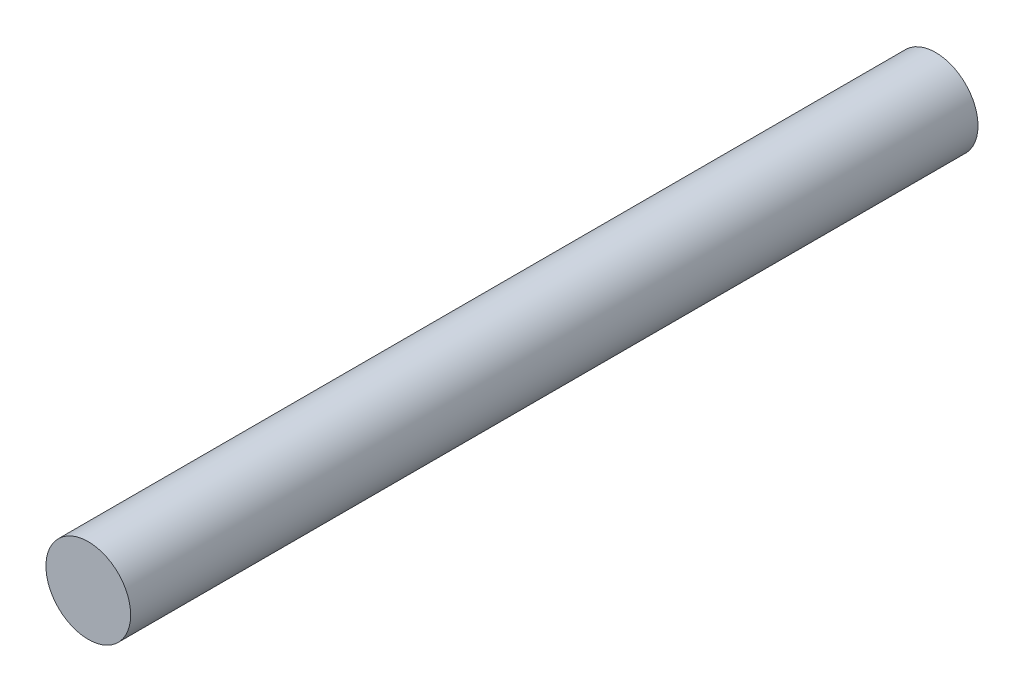
ISO-10303-21;
HEADER;
FILE_DESCRIPTION(('STEP AP214'),'2;1');
FILE_NAME('part.step','',(''),(''),'','','');
FILE_SCHEMA(('AUTOMOTIVE_DESIGN { 1 0 10303 214 1 1 1 1 }'));
ENDSEC;
DATA;
#1=APPLICATION_CONTEXT('core data for automotive mechanical design processes');
#2=APPLICATION_PROTOCOL_DEFINITION('international standard','automotive_design',2000,#1);
#3=PRODUCT_CONTEXT('',#1,'mechanical');
#4=PRODUCT('Part','Part','',(#3));
#5=PRODUCT_RELATED_PRODUCT_CATEGORY('part','',(#4));
#6=PRODUCT_DEFINITION_FORMATION('','',#4);
#7=PRODUCT_DEFINITION_CONTEXT('part definition',#1,'design');
#8=PRODUCT_DEFINITION('design','',#6,#7);
#9=PRODUCT_DEFINITION_SHAPE('','',#8);
#10=(LENGTH_UNIT() NAMED_UNIT(*) SI_UNIT(.MILLI.,.METRE.));
#11=(NAMED_UNIT(*) PLANE_ANGLE_UNIT() SI_UNIT($,.RADIAN.));
#12=(NAMED_UNIT(*) SI_UNIT($,.STERADIAN.) SOLID_ANGLE_UNIT());
#13=UNCERTAINTY_MEASURE_WITH_UNIT(LENGTH_MEASURE(1.E-05),#10,'distance_accuracy_value','');
#14=(GEOMETRIC_REPRESENTATION_CONTEXT(3) GLOBAL_UNCERTAINTY_ASSIGNED_CONTEXT((#13)) GLOBAL_UNIT_ASSIGNED_CONTEXT((#10,
#11,#12)) REPRESENTATION_CONTEXT('',''));
#15=CARTESIAN_POINT('',(0.,0.,0.));
#16=DIRECTION('',(0.,0.,1.));
#17=DIRECTION('',(1.,0.,0.));
#18=AXIS2_PLACEMENT_3D('',#15,#16,#17);
#19=CARTESIAN_POINT('',(0.,0.,50.));
#20=DIRECTION('',(0.,0.,-1.));
#21=DIRECTION('',(-1.,0.,0.));
#22=AXIS2_PLACEMENT_3D('',#19,#20,#21);
#23=CYLINDRICAL_SURFACE('',#22,2.5);
#24=CARTESIAN_POINT('',(0.,0.,50.));
#25=DIRECTION('',(0.,0.,1.));
#26=DIRECTION('',(1.,0.,0.));
#27=AXIS2_PLACEMENT_3D('',#24,#25,#26);
#28=CIRCLE('',#27,2.5);
#29=CARTESIAN_POINT('',(2.5,0.,50.));
#30=VERTEX_POINT('',#29);
#31=EDGE_CURVE('E10',#30,#30,#28,.T.);
#32=ORIENTED_EDGE('',*,*,#31,.F.);
#33=EDGE_LOOP('',(#32));
#34=FACE_BOUND('',#33,.T.);
#35=CARTESIAN_POINT('',(0.,0.,0.));
#36=DIRECTION('',(0.,0.,1.));
#37=DIRECTION('',(1.,0.,0.));
#38=AXIS2_PLACEMENT_3D('',#35,#36,#37);
#39=CIRCLE('',#38,2.5);
#40=CARTESIAN_POINT('',(2.5,0.,0.));
#41=VERTEX_POINT('',#40);
#42=EDGE_CURVE('E46',#41,#41,#39,.T.);
#43=ORIENTED_EDGE('',*,*,#42,.T.);
#44=EDGE_LOOP('',(#43));
#45=FACE_BOUND('',#44,.T.);
#46=ADVANCED_FACE('F43',(#34,#45),#23,.T.);
#47=CARTESIAN_POINT('',(0.,0.,50.));
#48=DIRECTION('',(0.,0.,1.));
#49=DIRECTION('',(1.,0.,0.));
#50=AXIS2_PLACEMENT_3D('',#47,#48,#49);
#51=PLANE('',#50);
#52=ORIENTED_EDGE('',*,*,#31,.T.);
#53=EDGE_LOOP('',(#52));
#54=FACE_BOUND('',#53,.T.);
#55=ADVANCED_FACE('F60',(#54),#51,.T.);
#56=CARTESIAN_POINT('',(0.,0.,0.));
#57=DIRECTION('',(0.,0.,1.));
#58=DIRECTION('',(1.,0.,0.));
#59=AXIS2_PLACEMENT_3D('',#56,#57,#58);
#60=PLANE('',#59);
#61=ORIENTED_EDGE('',*,*,#42,.F.);
#62=EDGE_LOOP('',(#61));
#63=FACE_BOUND('',#62,.T.);
#64=ADVANCED_FACE('F58',(#63),#60,.F.);
#65=CLOSED_SHELL('',(#46,#55,#64));
#66=MANIFOLD_SOLID_BREP('B2',#65);
#67=ADVANCED_BREP_SHAPE_REPRESENTATION('',(#18,#66),#14);
#68=SHAPE_DEFINITION_REPRESENTATION(#9,#67);
ENDSEC;
END-ISO-10303-21;
